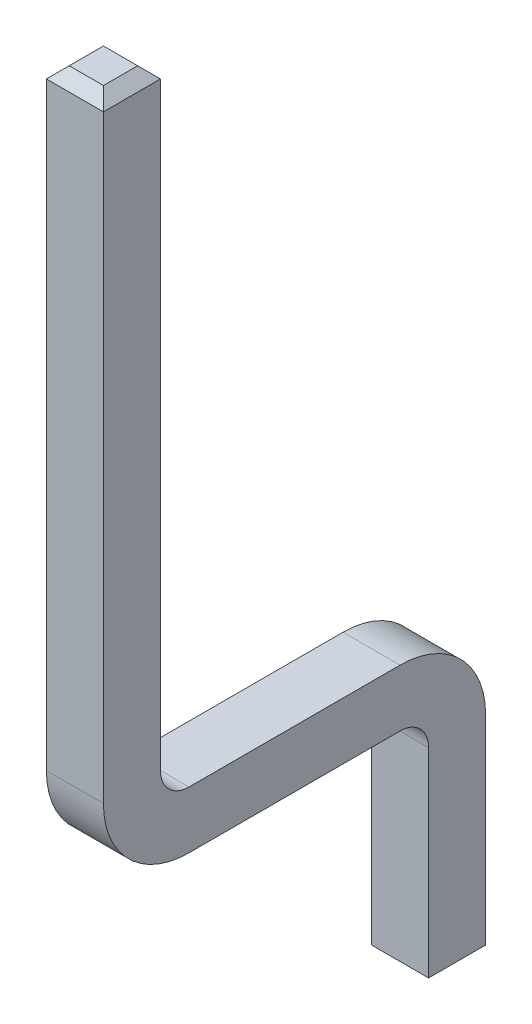
ISO-10303-21;
HEADER;
FILE_DESCRIPTION(('STEP AP214'),'2;1');
FILE_NAME('part.step','',(''),(''),'','','');
FILE_SCHEMA(('AUTOMOTIVE_DESIGN { 1 0 10303 214 1 1 1 1 }'));
ENDSEC;
DATA;
#1=APPLICATION_CONTEXT('core data for automotive mechanical design processes');
#2=APPLICATION_PROTOCOL_DEFINITION('international standard','automotive_design',2000,#1);
#3=PRODUCT_CONTEXT('',#1,'mechanical');
#4=PRODUCT('Part','Part','',(#3));
#5=PRODUCT_RELATED_PRODUCT_CATEGORY('part','',(#4));
#6=PRODUCT_DEFINITION_FORMATION('','',#4);
#7=PRODUCT_DEFINITION_CONTEXT('part definition',#1,'design');
#8=PRODUCT_DEFINITION('design','',#6,#7);
#9=PRODUCT_DEFINITION_SHAPE('','',#8);
#10=(LENGTH_UNIT() NAMED_UNIT(*) SI_UNIT(.MILLI.,.METRE.));
#11=(NAMED_UNIT(*) PLANE_ANGLE_UNIT() SI_UNIT($,.RADIAN.));
#12=(NAMED_UNIT(*) SI_UNIT($,.STERADIAN.) SOLID_ANGLE_UNIT());
#13=UNCERTAINTY_MEASURE_WITH_UNIT(LENGTH_MEASURE(1.E-05),#10,'distance_accuracy_value','');
#14=(GEOMETRIC_REPRESENTATION_CONTEXT(3) GLOBAL_UNCERTAINTY_ASSIGNED_CONTEXT((#13)) GLOBAL_UNIT_ASSIGNED_CONTEXT((#10,
#11,#12)) REPRESENTATION_CONTEXT('',''));
#15=CARTESIAN_POINT('',(0.,0.,0.));
#16=DIRECTION('',(0.,0.,1.));
#17=DIRECTION('',(1.,0.,0.));
#18=AXIS2_PLACEMENT_3D('',#15,#16,#17);
#19=CARTESIAN_POINT('',(0.800000000000005,-5.35,1.8));
#20=DIRECTION('',(-0.707106781186544,-0.707106781186551,0.));
#21=DIRECTION('',(0.707106781186551,-0.707106781186544,0.));
#22=AXIS2_PLACEMENT_3D('',#19,#20,#21);
#23=PLANE('',#22);
#24=DIRECTION('',(0.,0.,1.));
#25=VECTOR('',#24,1.);
#26=CARTESIAN_POINT('',(0.850000000000005,-5.4,0.250000000000002));
#27=LINE('',#26,#25);
#28=CARTESIAN_POINT('',(0.850000000000005,-5.4,0.100000000000003));
#29=VERTEX_POINT('',#28);
#30=CARTESIAN_POINT('',(0.850000000000005,-5.4,0.400000000000003));
#31=VERTEX_POINT('',#30);
#32=EDGE_CURVE('E117',#29,#31,#27,.T.);
#33=ORIENTED_EDGE('',*,*,#32,.T.);
#34=DIRECTION('',(0.577350269189619,-0.577350269189627,-0.577350269189631));
#35=VECTOR('',#34,1.);
#36=CARTESIAN_POINT('',(0.750000000000006,-5.3,0.500000000000004));
#37=LINE('',#36,#35);
#38=CARTESIAN_POINT('',(0.750000000000006,-5.3,0.500000000000004));
#39=VERTEX_POINT('',#38);
#40=EDGE_CURVE('E119',#39,#31,#37,.T.);
#41=ORIENTED_EDGE('',*,*,#40,.F.);
#42=DIRECTION('',(0.,0.,1.));
#43=VECTOR('',#42,1.);
#44=CARTESIAN_POINT('',(0.750000000000006,-5.3,3.35));
#45=LINE('',#44,#43);
#46=CARTESIAN_POINT('',(0.750000000000006,-5.3,0.));
#47=VERTEX_POINT('',#46);
#48=EDGE_CURVE('E236',#47,#39,#45,.T.);
#49=ORIENTED_EDGE('',*,*,#48,.F.);
#50=DIRECTION('',(-0.577350269189619,0.577350269189627,-0.577350269189631));
#51=VECTOR('',#50,1.);
#52=CARTESIAN_POINT('',(0.850000000000005,-5.4,0.100000000000004));
#53=LINE('',#52,#51);
#54=EDGE_CURVE('E122',#29,#47,#53,.T.);
#55=ORIENTED_EDGE('',*,*,#54,.F.);
#56=EDGE_LOOP('',(#33,#41,#49,#55));
#57=FACE_BOUND('',#56,.T.);
#58=ADVANCED_FACE('F14',(#57),#23,.T.);
#59=CARTESIAN_POINT('',(0.800000000000005,2.75,3.225));
#60=DIRECTION('',(-0.707106781186548,0.707106781186547,0.));
#61=DIRECTION('',(-0.707106781186547,-0.707106781186548,0.));
#62=AXIS2_PLACEMENT_3D('',#59,#60,#61);
#63=PLANE('',#62);
#64=DIRECTION('',(0.,0.,1.));
#65=VECTOR('',#64,1.);
#66=CARTESIAN_POINT('',(0.750000000000006,2.7,3.35));
#67=LINE('',#66,#65);
#68=CARTESIAN_POINT('',(0.750000000000006,2.7,3.35));
#69=VERTEX_POINT('',#68);
#70=CARTESIAN_POINT('',(0.750000000000006,2.7,2.85));
#71=VERTEX_POINT('',#70);
#72=EDGE_CURVE('E233',#69,#71,#67,.F.);
#73=ORIENTED_EDGE('',*,*,#72,.F.);
#74=DIRECTION('',(-0.577350269189622,-0.577350269189625,0.57735026918963));
#75=VECTOR('',#74,1.);
#76=CARTESIAN_POINT('',(0.850000000000005,2.8,3.25));
#77=LINE('',#76,#75);
#78=CARTESIAN_POINT('',(0.850000000000005,2.8,3.25));
#79=VERTEX_POINT('',#78);
#80=EDGE_CURVE('E239',#79,#69,#77,.T.);
#81=ORIENTED_EDGE('',*,*,#80,.F.);
#82=DIRECTION('',(0.,0.,1.));
#83=VECTOR('',#82,1.);
#84=CARTESIAN_POINT('',(0.850000000000005,2.8,3.1));
#85=LINE('',#84,#83);
#86=CARTESIAN_POINT('',(0.850000000000005,2.8,2.95));
#87=VERTEX_POINT('',#86);
#88=EDGE_CURVE('E96',#87,#79,#85,.T.);
#89=ORIENTED_EDGE('',*,*,#88,.F.);
#90=DIRECTION('',(0.577350269189622,0.577350269189627,0.577350269189629));
#91=VECTOR('',#90,1.);
#92=CARTESIAN_POINT('',(0.750000000000006,2.7,2.85));
#93=LINE('',#92,#91);
#94=EDGE_CURVE('E247',#71,#87,#93,.T.);
#95=ORIENTED_EDGE('',*,*,#94,.F.);
#96=EDGE_LOOP('',(#73,#81,#89,#95));
#97=FACE_BOUND('',#96,.T.);
#98=ADVANCED_FACE('F386',(#97),#63,.T.);
#99=CARTESIAN_POINT('',(1.125,-5.35,0.450000000000004));
#100=DIRECTION('',(0.,-0.707106781186551,0.707106781186544));
#101=DIRECTION('',(0.,-0.707106781186544,-0.707106781186551));
#102=AXIS2_PLACEMENT_3D('',#99,#100,#101);
#103=PLANE('',#102);
#104=DIRECTION('',(1.,0.,0.));
#105=VECTOR('',#104,1.);
#106=CARTESIAN_POINT('',(1.,-5.4,0.400000000000003));
#107=LINE('',#106,#105);
#108=CARTESIAN_POINT('',(1.15,-5.4,0.400000000000004));
#109=VERTEX_POINT('',#108);
#110=EDGE_CURVE('E126',#31,#109,#107,.T.);
#111=ORIENTED_EDGE('',*,*,#110,.T.);
#112=DIRECTION('',(-0.577350269189629,-0.577350269189623,-0.577350269189625));
#113=VECTOR('',#112,1.);
#114=CARTESIAN_POINT('',(1.25,-5.3,0.500000000000004));
#115=LINE('',#114,#113);
#116=CARTESIAN_POINT('',(1.25,-5.3,0.500000000000003));
#117=VERTEX_POINT('',#116);
#118=EDGE_CURVE('E217',#117,#109,#115,.T.);
#119=ORIENTED_EDGE('',*,*,#118,.F.);
#120=DIRECTION('',(1.,0.,0.));
#121=VECTOR('',#120,1.);
#122=CARTESIAN_POINT('',(1.25,-5.3,0.500000000000004));
#123=LINE('',#122,#121);
#124=EDGE_CURVE('E134',#39,#117,#123,.T.);
#125=ORIENTED_EDGE('',*,*,#124,.F.);
#126=ORIENTED_EDGE('',*,*,#40,.T.);
#127=EDGE_LOOP('',(#111,#119,#125,#126));
#128=FACE_BOUND('',#127,.T.);
#129=ADVANCED_FACE('F130',(#128),#103,.T.);
#130=CARTESIAN_POINT('',(1.,-5.4,0.250000000000002));
#131=DIRECTION('',(0.,1.,0.));
#132=DIRECTION('',(0.,0.,1.));
#133=AXIS2_PLACEMENT_3D('',#130,#131,#132);
#134=PLANE('',#133);
#135=DIRECTION('',(0.,0.,1.));
#136=VECTOR('',#135,1.);
#137=CARTESIAN_POINT('',(1.15,-5.4,1.55));
#138=LINE('',#137,#136);
#139=CARTESIAN_POINT('',(1.15,-5.4,0.100000000000003));
#140=VERTEX_POINT('',#139);
#141=EDGE_CURVE('E139',#109,#140,#138,.F.);
#142=ORIENTED_EDGE('',*,*,#141,.F.);
#143=ORIENTED_EDGE('',*,*,#110,.F.);
#144=ORIENTED_EDGE('',*,*,#32,.F.);
#145=DIRECTION('',(1.,0.,0.));
#146=VECTOR('',#145,1.);
#147=CARTESIAN_POINT('',(0.875000000000005,-5.4,0.100000000000004));
#148=LINE('',#147,#146);
#149=EDGE_CURVE('E141',#140,#29,#148,.F.);
#150=ORIENTED_EDGE('',*,*,#149,.F.);
#151=EDGE_LOOP('',(#142,#143,#144,#150));
#152=FACE_BOUND('',#151,.T.);
#153=ADVANCED_FACE('F137',(#152),#134,.F.);
#154=CARTESIAN_POINT('',(0.875000000000005,-5.35,0.0500000000000028));
#155=DIRECTION('',(0.,-0.707106781186551,-0.707106781186544));
#156=DIRECTION('',(0.,0.707106781186544,-0.707106781186551));
#157=AXIS2_PLACEMENT_3D('',#154,#155,#156);
#158=PLANE('',#157);
#159=DIRECTION('',(1.,0.,0.));
#160=VECTOR('',#159,1.);
#161=CARTESIAN_POINT('',(0.750000000000006,-5.3,0.));
#162=LINE('',#161,#160);
#163=CARTESIAN_POINT('',(1.25,-5.3,0.));
#164=VERTEX_POINT('',#163);
#165=EDGE_CURVE('E199',#164,#47,#162,.F.);
#166=ORIENTED_EDGE('',*,*,#165,.F.);
#167=DIRECTION('',(0.577350269189628,0.577350269189622,-0.577350269189627));
#168=VECTOR('',#167,1.);
#169=CARTESIAN_POINT('',(1.15,-5.4,0.100000000000003));
#170=LINE('',#169,#168);
#171=EDGE_CURVE('E205',#140,#164,#170,.T.);
#172=ORIENTED_EDGE('',*,*,#171,.F.);
#173=ORIENTED_EDGE('',*,*,#149,.T.);
#174=ORIENTED_EDGE('',*,*,#54,.T.);
#175=EDGE_LOOP('',(#166,#172,#173,#174));
#176=FACE_BOUND('',#175,.T.);
#177=ADVANCED_FACE('F298',(#176),#158,.T.);
#178=CARTESIAN_POINT('',(1.,2.8,3.1));
#179=DIRECTION('',(0.,1.,0.));
#180=DIRECTION('',(0.,0.,1.));
#181=AXIS2_PLACEMENT_3D('',#178,#179,#180);
#182=PLANE('',#181);
#183=DIRECTION('',(0.,0.,1.));
#184=VECTOR('',#183,1.);
#185=CARTESIAN_POINT('',(1.15,2.8,2.975));
#186=LINE('',#185,#184);
#187=CARTESIAN_POINT('',(1.15,2.8,2.95));
#188=VERTEX_POINT('',#187);
#189=CARTESIAN_POINT('',(1.15,2.8,3.25));
#190=VERTEX_POINT('',#189);
#191=EDGE_CURVE('E250',#188,#190,#186,.T.);
#192=ORIENTED_EDGE('',*,*,#191,.F.);
#193=DIRECTION('',(1.,0.,0.));
#194=VECTOR('',#193,1.);
#195=CARTESIAN_POINT('',(0.875000000000005,2.8,2.95));
#196=LINE('',#195,#194);
#197=EDGE_CURVE('E158',#87,#188,#196,.T.);
#198=ORIENTED_EDGE('',*,*,#197,.F.);
#199=ORIENTED_EDGE('',*,*,#88,.T.);
#200=DIRECTION('',(1.,0.,0.));
#201=VECTOR('',#200,1.);
#202=CARTESIAN_POINT('',(1.125,2.8,3.25));
#203=LINE('',#202,#201);
#204=EDGE_CURVE('E242',#190,#79,#203,.F.);
#205=ORIENTED_EDGE('',*,*,#204,.F.);
#206=EDGE_LOOP('',(#192,#198,#199,#205));
#207=FACE_BOUND('',#206,.T.);
#208=ADVANCED_FACE('F375',(#207),#182,.T.);
#209=CARTESIAN_POINT('',(0.875000000000005,2.75,2.9));
#210=DIRECTION('',(0.,0.707106781186548,-0.707106781186547));
#211=DIRECTION('',(0.,0.707106781186547,0.707106781186548));
#212=AXIS2_PLACEMENT_3D('',#209,#210,#211);
#213=PLANE('',#212);
#214=DIRECTION('',(-1.,0.,0.));
#215=VECTOR('',#214,1.);
#216=CARTESIAN_POINT('',(0.750000000000006,2.7,2.85));
#217=LINE('',#216,#215);
#218=CARTESIAN_POINT('',(1.25,2.7,2.85));
#219=VERTEX_POINT('',#218);
#220=EDGE_CURVE('E254',#71,#219,#217,.F.);
#221=ORIENTED_EDGE('',*,*,#220,.F.);
#222=ORIENTED_EDGE('',*,*,#94,.T.);
#223=ORIENTED_EDGE('',*,*,#197,.T.);
#224=DIRECTION('',(-0.577350269189626,0.577350269189625,0.577350269189627));
#225=VECTOR('',#224,1.);
#226=CARTESIAN_POINT('',(1.25,2.7,2.85));
#227=LINE('',#226,#225);
#228=EDGE_CURVE('E319',#219,#188,#227,.T.);
#229=ORIENTED_EDGE('',*,*,#228,.F.);
#230=EDGE_LOOP('',(#221,#222,#223,#229));
#231=FACE_BOUND('',#230,.T.);
#232=ADVANCED_FACE('F379',(#231),#213,.T.);
#233=CARTESIAN_POINT('',(1.125,2.75,3.3));
#234=DIRECTION('',(0.,0.707106781186548,0.707106781186547));
#235=DIRECTION('',(0.,-0.707106781186547,0.707106781186548));
#236=AXIS2_PLACEMENT_3D('',#233,#234,#235);
#237=PLANE('',#236);
#238=ORIENTED_EDGE('',*,*,#204,.T.);
#239=ORIENTED_EDGE('',*,*,#80,.T.);
#240=DIRECTION('',(1.,0.,0.));
#241=VECTOR('',#240,1.);
#242=CARTESIAN_POINT('',(1.25,2.7,3.35));
#243=LINE('',#242,#241);
#244=CARTESIAN_POINT('',(1.25,2.7,3.35));
#245=VERTEX_POINT('',#244);
#246=EDGE_CURVE('E230',#245,#69,#243,.F.);
#247=ORIENTED_EDGE('',*,*,#246,.F.);
#248=DIRECTION('',(0.577350269189627,-0.577350269189625,0.577350269189625));
#249=VECTOR('',#248,1.);
#250=CARTESIAN_POINT('',(1.15,2.8,3.25));
#251=LINE('',#250,#249);
#252=EDGE_CURVE('E253',#190,#245,#251,.T.);
#253=ORIENTED_EDGE('',*,*,#252,.F.);
#254=EDGE_LOOP('',(#238,#239,#247,#253));
#255=FACE_BOUND('',#254,.T.);
#256=ADVANCED_FACE('F387',(#255),#237,.T.);
#257=CARTESIAN_POINT('',(0.750000000000006,3.2,3.35));
#258=DIRECTION('',(-1.,0.,0.));
#259=DIRECTION('',(0.,0.,1.));
#260=AXIS2_PLACEMENT_3D('',#257,#258,#259);
#261=PLANE('',#260);
#262=CARTESIAN_POINT('',(0.750000000000006,-2.55,2.6));
#263=DIRECTION('',(1.,0.,0.));
#264=DIRECTION('',(0.,0.,-1.));
#265=AXIS2_PLACEMENT_3D('',#262,#263,#264);
#266=CIRCLE('',#265,0.25);
#267=CARTESIAN_POINT('',(0.750000000000006,-2.55,2.85));
#268=VERTEX_POINT('',#267);
#269=CARTESIAN_POINT('',(0.750000000000006,-2.8,2.6));
#270=VERTEX_POINT('',#269);
#271=EDGE_CURVE('E184',#268,#270,#266,.T.);
#272=ORIENTED_EDGE('',*,*,#271,.T.);
#273=DIRECTION('',(0.,0.,1.));
#274=VECTOR('',#273,1.);
#275=CARTESIAN_POINT('',(0.750000000000006,-2.8,2.6));
#276=LINE('',#275,#274);
#277=CARTESIAN_POINT('',(0.750000000000006,-2.8,0.750000000000004));
#278=VERTEX_POINT('',#277);
#279=EDGE_CURVE('E186',#278,#270,#276,.T.);
#280=ORIENTED_EDGE('',*,*,#279,.F.);
#281=CARTESIAN_POINT('',(0.750000000000006,-3.55,0.750000000000004));
#282=DIRECTION('',(-1.,0.,0.));
#283=DIRECTION('',(0.,0.,1.));
#284=AXIS2_PLACEMENT_3D('',#281,#282,#283);
#285=CIRCLE('',#284,0.750000000000001);
#286=CARTESIAN_POINT('',(0.750000000000006,-3.55,0.));
#287=VERTEX_POINT('',#286);
#288=EDGE_CURVE('E187',#287,#278,#285,.F.);
#289=ORIENTED_EDGE('',*,*,#288,.F.);
#290=DIRECTION('',(0.,1.,0.));
#291=VECTOR('',#290,1.);
#292=CARTESIAN_POINT('',(0.750000000000006,-3.55,0.));
#293=LINE('',#292,#291);
#294=EDGE_CURVE('E196',#47,#287,#293,.T.);
#295=ORIENTED_EDGE('',*,*,#294,.F.);
#296=ORIENTED_EDGE('',*,*,#48,.T.);
#297=DIRECTION('',(0.,1.,0.));
#298=VECTOR('',#297,1.);
#299=CARTESIAN_POINT('',(0.750000000000006,-3.55,0.500000000000003));
#300=LINE('',#299,#298);
#301=CARTESIAN_POINT('',(0.750000000000006,-3.55,0.500000000000003));
#302=VERTEX_POINT('',#301);
#303=EDGE_CURVE('E152',#302,#39,#300,.F.);
#304=ORIENTED_EDGE('',*,*,#303,.F.);
#305=CARTESIAN_POINT('',(0.750000000000006,-3.55,0.750000000000004));
#306=DIRECTION('',(-1.,0.,0.));
#307=DIRECTION('',(0.,0.,1.));
#308=AXIS2_PLACEMENT_3D('',#305,#306,#307);
#309=CIRCLE('',#308,0.25);
#310=CARTESIAN_POINT('',(0.750000000000006,-3.3,0.750000000000004));
#311=VERTEX_POINT('',#310);
#312=EDGE_CURVE('E17',#302,#311,#309,.F.);
#313=ORIENTED_EDGE('',*,*,#312,.T.);
#314=DIRECTION('',(0.,0.,1.));
#315=VECTOR('',#314,1.);
#316=CARTESIAN_POINT('',(0.750000000000006,-3.3,2.6));
#317=LINE('',#316,#315);
#318=CARTESIAN_POINT('',(0.750000000000006,-3.3,2.6));
#319=VERTEX_POINT('',#318);
#320=EDGE_CURVE('E179',#319,#311,#317,.F.);
#321=ORIENTED_EDGE('',*,*,#320,.F.);
#322=CARTESIAN_POINT('',(0.750000000000006,-2.55,2.6));
#323=DIRECTION('',(1.,0.,0.));
#324=DIRECTION('',(0.,0.,-1.));
#325=AXIS2_PLACEMENT_3D('',#322,#323,#324);
#326=CIRCLE('',#325,0.750000000000001);
#327=CARTESIAN_POINT('',(0.750000000000006,-2.55,3.35));
#328=VERTEX_POINT('',#327);
#329=EDGE_CURVE('E180',#328,#319,#326,.T.);
#330=ORIENTED_EDGE('',*,*,#329,.F.);
#331=DIRECTION('',(0.,1.,0.));
#332=VECTOR('',#331,1.);
#333=CARTESIAN_POINT('',(0.750000000000006,3.2,3.35));
#334=LINE('',#333,#332);
#335=EDGE_CURVE('E228',#69,#328,#334,.F.);
#336=ORIENTED_EDGE('',*,*,#335,.F.);
#337=ORIENTED_EDGE('',*,*,#72,.T.);
#338=DIRECTION('',(0.,1.,0.));
#339=VECTOR('',#338,1.);
#340=CARTESIAN_POINT('',(0.750000000000006,3.2,2.85));
#341=LINE('',#340,#339);
#342=EDGE_CURVE('E265',#268,#71,#341,.T.);
#343=ORIENTED_EDGE('',*,*,#342,.F.);
#344=EDGE_LOOP('',(#272,#280,#289,#295,#296,#304,#313,#321,#330,#336,#337,#343));
#345=FACE_BOUND('',#344,.T.);
#346=ADVANCED_FACE('F293',(#345),#261,.T.);
#347=CARTESIAN_POINT('',(1.,-3.55,0.750000000000004));
#348=DIRECTION('',(-1.,0.,0.));
#349=DIRECTION('',(0.,0.,1.));
#350=AXIS2_PLACEMENT_3D('',#347,#348,#349);
#351=CYLINDRICAL_SURFACE('',#350,0.25);
#352=DIRECTION('',(1.,0.,0.));
#353=VECTOR('',#352,1.);
#354=CARTESIAN_POINT('',(1.25,-3.55,0.500000000000004));
#355=LINE('',#354,#353);
#356=CARTESIAN_POINT('',(1.25,-3.55,0.500000000000003));
#357=VERTEX_POINT('',#356);
#358=EDGE_CURVE('E154',#357,#302,#355,.F.);
#359=ORIENTED_EDGE('',*,*,#358,.F.);
#360=CARTESIAN_POINT('',(1.25,-3.55,0.750000000000004));
#361=DIRECTION('',(-1.,0.,0.));
#362=DIRECTION('',(0.,0.,1.));
#363=AXIS2_PLACEMENT_3D('',#360,#361,#362);
#364=CIRCLE('',#363,0.25);
#365=CARTESIAN_POINT('',(1.25,-3.3,0.750000000000004));
#366=VERTEX_POINT('',#365);
#367=EDGE_CURVE('E175',#366,#357,#364,.T.);
#368=ORIENTED_EDGE('',*,*,#367,.F.);
#369=DIRECTION('',(1.,0.,0.));
#370=VECTOR('',#369,1.);
#371=CARTESIAN_POINT('',(1.25,-3.3,0.750000000000004));
#372=LINE('',#371,#370);
#373=EDGE_CURVE('E182',#311,#366,#372,.T.);
#374=ORIENTED_EDGE('',*,*,#373,.F.);
#375=ORIENTED_EDGE('',*,*,#312,.F.);
#376=EDGE_LOOP('',(#359,#368,#374,#375));
#377=FACE_BOUND('',#376,.T.);
#378=ADVANCED_FACE('F395',(#377),#351,.F.);
#379=CARTESIAN_POINT('',(1.25,-3.55,0.500000000000004));
#380=DIRECTION('',(0.,0.,1.));
#381=DIRECTION('',(1.,0.,0.));
#382=AXIS2_PLACEMENT_3D('',#379,#380,#381);
#383=PLANE('',#382);
#384=ORIENTED_EDGE('',*,*,#124,.T.);
#385=DIRECTION('',(0.,1.,0.));
#386=VECTOR('',#385,1.);
#387=CARTESIAN_POINT('',(1.25,3.2,0.500000000000003));
#388=LINE('',#387,#386);
#389=EDGE_CURVE('E178',#357,#117,#388,.F.);
#390=ORIENTED_EDGE('',*,*,#389,.F.);
#391=ORIENTED_EDGE('',*,*,#358,.T.);
#392=ORIENTED_EDGE('',*,*,#303,.T.);
#393=EDGE_LOOP('',(#384,#390,#391,#392));
#394=FACE_BOUND('',#393,.T.);
#395=ADVANCED_FACE('F291',(#394),#383,.T.);
#396=CARTESIAN_POINT('',(1.2,-5.35,1.55));
#397=DIRECTION('',(0.707106781186544,-0.707106781186551,0.));
#398=DIRECTION('',(0.707106781186551,0.707106781186544,0.));
#399=AXIS2_PLACEMENT_3D('',#396,#397,#398);
#400=PLANE('',#399);
#401=ORIENTED_EDGE('',*,*,#141,.T.);
#402=ORIENTED_EDGE('',*,*,#171,.T.);
#403=DIRECTION('',(0.,0.,-1.));
#404=VECTOR('',#403,1.);
#405=CARTESIAN_POINT('',(1.25,-5.3,2.85));
#406=LINE('',#405,#404);
#407=EDGE_CURVE('E208',#117,#164,#406,.T.);
#408=ORIENTED_EDGE('',*,*,#407,.F.);
#409=ORIENTED_EDGE('',*,*,#118,.T.);
#410=EDGE_LOOP('',(#401,#402,#408,#409));
#411=FACE_BOUND('',#410,.T.);
#412=ADVANCED_FACE('F283',(#411),#400,.T.);
#413=CARTESIAN_POINT('',(0.750000000000006,-3.55,0.));
#414=DIRECTION('',(0.,0.,-1.));
#415=DIRECTION('',(0.,1.,0.));
#416=AXIS2_PLACEMENT_3D('',#413,#414,#415);
#417=PLANE('',#416);
#418=ORIENTED_EDGE('',*,*,#165,.T.);
#419=ORIENTED_EDGE('',*,*,#294,.T.);
#420=DIRECTION('',(-1.,0.,0.));
#421=VECTOR('',#420,1.);
#422=CARTESIAN_POINT('',(1.,-3.55,0.));
#423=LINE('',#422,#421);
#424=CARTESIAN_POINT('',(1.25,-3.55,0.));
#425=VERTEX_POINT('',#424);
#426=EDGE_CURVE('E189',#425,#287,#423,.T.);
#427=ORIENTED_EDGE('',*,*,#426,.F.);
#428=DIRECTION('',(0.,1.,0.));
#429=VECTOR('',#428,1.);
#430=CARTESIAN_POINT('',(1.25,3.2,0.));
#431=LINE('',#430,#429);
#432=EDGE_CURVE('E174',#164,#425,#431,.T.);
#433=ORIENTED_EDGE('',*,*,#432,.F.);
#434=EDGE_LOOP('',(#418,#419,#427,#433));
#435=FACE_BOUND('',#434,.T.);
#436=ADVANCED_FACE('F301',(#435),#417,.T.);
#437=CARTESIAN_POINT('',(1.,-3.55,0.750000000000004));
#438=DIRECTION('',(-1.,0.,0.));
#439=DIRECTION('',(0.,0.,1.));
#440=AXIS2_PLACEMENT_3D('',#437,#438,#439);
#441=CYLINDRICAL_SURFACE('',#440,0.750000000000001);
#442=DIRECTION('',(1.,0.,0.));
#443=VECTOR('',#442,1.);
#444=CARTESIAN_POINT('',(0.750000000000006,-2.8,0.750000000000004));
#445=LINE('',#444,#443);
#446=CARTESIAN_POINT('',(1.25,-2.8,0.750000000000004));
#447=VERTEX_POINT('',#446);
#448=EDGE_CURVE('E188',#447,#278,#445,.F.);
#449=ORIENTED_EDGE('',*,*,#448,.F.);
#450=CARTESIAN_POINT('',(1.25,-3.55,0.750000000000004));
#451=DIRECTION('',(-1.,0.,0.));
#452=DIRECTION('',(0.,0.,1.));
#453=AXIS2_PLACEMENT_3D('',#450,#451,#452);
#454=CIRCLE('',#453,0.750000000000001);
#455=EDGE_CURVE('E171',#425,#447,#454,.F.);
#456=ORIENTED_EDGE('',*,*,#455,.F.);
#457=ORIENTED_EDGE('',*,*,#426,.T.);
#458=ORIENTED_EDGE('',*,*,#288,.T.);
#459=EDGE_LOOP('',(#449,#456,#457,#458));
#460=FACE_BOUND('',#459,.T.);
#461=ADVANCED_FACE('F420',(#460),#441,.T.);
#462=CARTESIAN_POINT('',(0.750000000000006,-2.8,2.6));
#463=DIRECTION('',(0.,1.,0.));
#464=DIRECTION('',(0.,0.,1.));
#465=AXIS2_PLACEMENT_3D('',#462,#463,#464);
#466=PLANE('',#465);
#467=DIRECTION('',(1.,0.,0.));
#468=VECTOR('',#467,1.);
#469=CARTESIAN_POINT('',(1.,-2.8,2.6));
#470=LINE('',#469,#468);
#471=CARTESIAN_POINT('',(1.25,-2.8,2.6));
#472=VERTEX_POINT('',#471);
#473=EDGE_CURVE('E185',#270,#472,#470,.T.);
#474=ORIENTED_EDGE('',*,*,#473,.T.);
#475=DIRECTION('',(0.,0.,-1.));
#476=VECTOR('',#475,1.);
#477=CARTESIAN_POINT('',(1.25,-2.8,2.85));
#478=LINE('',#477,#476);
#479=EDGE_CURVE('E170',#447,#472,#478,.F.);
#480=ORIENTED_EDGE('',*,*,#479,.F.);
#481=ORIENTED_EDGE('',*,*,#448,.T.);
#482=ORIENTED_EDGE('',*,*,#279,.T.);
#483=EDGE_LOOP('',(#474,#480,#481,#482));
#484=FACE_BOUND('',#483,.T.);
#485=ADVANCED_FACE('F344',(#484),#466,.T.);
#486=CARTESIAN_POINT('',(1.,-2.55,2.6));
#487=DIRECTION('',(1.,0.,0.));
#488=DIRECTION('',(0.,0.,-1.));
#489=AXIS2_PLACEMENT_3D('',#486,#487,#488);
#490=CYLINDRICAL_SURFACE('',#489,0.25);
#491=ORIENTED_EDGE('',*,*,#473,.F.);
#492=ORIENTED_EDGE('',*,*,#271,.F.);
#493=DIRECTION('',(-1.,0.,0.));
#494=VECTOR('',#493,1.);
#495=CARTESIAN_POINT('',(0.750000000000006,-2.55,2.85));
#496=LINE('',#495,#494);
#497=CARTESIAN_POINT('',(1.25,-2.55,2.85));
#498=VERTEX_POINT('',#497);
#499=EDGE_CURVE('E268',#498,#268,#496,.T.);
#500=ORIENTED_EDGE('',*,*,#499,.F.);
#501=CARTESIAN_POINT('',(1.25,-2.55,2.6));
#502=DIRECTION('',(1.,0.,0.));
#503=DIRECTION('',(0.,0.,-1.));
#504=AXIS2_PLACEMENT_3D('',#501,#502,#503);
#505=CIRCLE('',#504,0.25);
#506=EDGE_CURVE('E166',#472,#498,#505,.F.);
#507=ORIENTED_EDGE('',*,*,#506,.F.);
#508=EDGE_LOOP('',(#491,#492,#500,#507));
#509=FACE_BOUND('',#508,.T.);
#510=ADVANCED_FACE('F347',(#509),#490,.F.);
#511=CARTESIAN_POINT('',(0.750000000000006,3.2,2.85));
#512=DIRECTION('',(0.,0.,-1.));
#513=DIRECTION('',(-1.,0.,0.));
#514=AXIS2_PLACEMENT_3D('',#511,#512,#513);
#515=PLANE('',#514);
#516=ORIENTED_EDGE('',*,*,#220,.T.);
#517=DIRECTION('',(0.,1.,0.));
#518=VECTOR('',#517,1.);
#519=CARTESIAN_POINT('',(1.25,3.2,2.85));
#520=LINE('',#519,#518);
#521=EDGE_CURVE('E169',#498,#219,#520,.T.);
#522=ORIENTED_EDGE('',*,*,#521,.F.);
#523=ORIENTED_EDGE('',*,*,#499,.T.);
#524=ORIENTED_EDGE('',*,*,#342,.T.);
#525=EDGE_LOOP('',(#516,#522,#523,#524));
#526=FACE_BOUND('',#525,.T.);
#527=ADVANCED_FACE('F382',(#526),#515,.T.);
#528=CARTESIAN_POINT('',(1.2,2.75,2.975));
#529=DIRECTION('',(0.707106781186547,0.707106781186548,0.));
#530=DIRECTION('',(-0.707106781186548,0.707106781186547,0.));
#531=AXIS2_PLACEMENT_3D('',#528,#529,#530);
#532=PLANE('',#531);
#533=DIRECTION('',(0.,0.,-1.));
#534=VECTOR('',#533,1.);
#535=CARTESIAN_POINT('',(1.25,2.7,2.85));
#536=LINE('',#535,#534);
#537=EDGE_CURVE('E322',#219,#245,#536,.F.);
#538=ORIENTED_EDGE('',*,*,#537,.F.);
#539=ORIENTED_EDGE('',*,*,#228,.T.);
#540=ORIENTED_EDGE('',*,*,#191,.T.);
#541=ORIENTED_EDGE('',*,*,#252,.T.);
#542=EDGE_LOOP('',(#538,#539,#540,#541));
#543=FACE_BOUND('',#542,.T.);
#544=ADVANCED_FACE('F380',(#543),#532,.T.);
#545=CARTESIAN_POINT('',(1.25,3.2,3.35));
#546=DIRECTION('',(0.,0.,1.));
#547=DIRECTION('',(1.,0.,0.));
#548=AXIS2_PLACEMENT_3D('',#545,#546,#547);
#549=PLANE('',#548);
#550=ORIENTED_EDGE('',*,*,#246,.T.);
#551=ORIENTED_EDGE('',*,*,#335,.T.);
#552=DIRECTION('',(1.,0.,0.));
#553=VECTOR('',#552,1.);
#554=CARTESIAN_POINT('',(1.,-2.55,3.35));
#555=LINE('',#554,#553);
#556=CARTESIAN_POINT('',(1.25,-2.55,3.35));
#557=VERTEX_POINT('',#556);
#558=EDGE_CURVE('E183',#557,#328,#555,.F.);
#559=ORIENTED_EDGE('',*,*,#558,.F.);
#560=DIRECTION('',(0.,1.,0.));
#561=VECTOR('',#560,1.);
#562=CARTESIAN_POINT('',(1.25,3.2,3.35));
#563=LINE('',#562,#561);
#564=EDGE_CURVE('E165',#245,#557,#563,.F.);
#565=ORIENTED_EDGE('',*,*,#564,.F.);
#566=EDGE_LOOP('',(#550,#551,#559,#565));
#567=FACE_BOUND('',#566,.T.);
#568=ADVANCED_FACE('F361',(#567),#549,.T.);
#569=CARTESIAN_POINT('',(1.,-2.55,2.6));
#570=DIRECTION('',(1.,0.,0.));
#571=DIRECTION('',(0.,0.,-1.));
#572=AXIS2_PLACEMENT_3D('',#569,#570,#571);
#573=CYLINDRICAL_SURFACE('',#572,0.750000000000001);
#574=ORIENTED_EDGE('',*,*,#558,.T.);
#575=ORIENTED_EDGE('',*,*,#329,.T.);
#576=DIRECTION('',(1.,0.,0.));
#577=VECTOR('',#576,1.);
#578=CARTESIAN_POINT('',(1.25,-3.3,2.6));
#579=LINE('',#578,#577);
#580=CARTESIAN_POINT('',(1.25,-3.3,2.6));
#581=VERTEX_POINT('',#580);
#582=EDGE_CURVE('E32',#581,#319,#579,.F.);
#583=ORIENTED_EDGE('',*,*,#582,.F.);
#584=CARTESIAN_POINT('',(1.25,-2.55,2.6));
#585=DIRECTION('',(1.,0.,0.));
#586=DIRECTION('',(0.,0.,-1.));
#587=AXIS2_PLACEMENT_3D('',#584,#585,#586);
#588=CIRCLE('',#587,0.750000000000001);
#589=EDGE_CURVE('E23',#557,#581,#588,.T.);
#590=ORIENTED_EDGE('',*,*,#589,.F.);
#591=EDGE_LOOP('',(#574,#575,#583,#590));
#592=FACE_BOUND('',#591,.T.);
#593=ADVANCED_FACE('F404',(#592),#573,.T.);
#594=CARTESIAN_POINT('',(1.25,-3.3,2.6));
#595=DIRECTION('',(0.,-1.,0.));
#596=DIRECTION('',(1.,0.,0.));
#597=AXIS2_PLACEMENT_3D('',#594,#595,#596);
#598=PLANE('',#597);
#599=ORIENTED_EDGE('',*,*,#582,.T.);
#600=ORIENTED_EDGE('',*,*,#320,.T.);
#601=ORIENTED_EDGE('',*,*,#373,.T.);
#602=DIRECTION('',(0.,0.,-1.));
#603=VECTOR('',#602,1.);
#604=CARTESIAN_POINT('',(1.25,-3.3,2.85));
#605=LINE('',#604,#603);
#606=EDGE_CURVE('E9',#581,#366,#605,.T.);
#607=ORIENTED_EDGE('',*,*,#606,.F.);
#608=EDGE_LOOP('',(#599,#600,#601,#607));
#609=FACE_BOUND('',#608,.T.);
#610=ADVANCED_FACE('F399',(#609),#598,.T.);
#611=CARTESIAN_POINT('',(1.25,3.2,2.85));
#612=DIRECTION('',(1.,0.,0.));
#613=DIRECTION('',(0.,0.,-1.));
#614=AXIS2_PLACEMENT_3D('',#611,#612,#613);
#615=PLANE('',#614);
#616=ORIENTED_EDGE('',*,*,#589,.T.);
#617=ORIENTED_EDGE('',*,*,#606,.T.);
#618=ORIENTED_EDGE('',*,*,#367,.T.);
#619=ORIENTED_EDGE('',*,*,#389,.T.);
#620=ORIENTED_EDGE('',*,*,#407,.T.);
#621=ORIENTED_EDGE('',*,*,#432,.T.);
#622=ORIENTED_EDGE('',*,*,#455,.T.);
#623=ORIENTED_EDGE('',*,*,#479,.T.);
#624=ORIENTED_EDGE('',*,*,#506,.T.);
#625=ORIENTED_EDGE('',*,*,#521,.T.);
#626=ORIENTED_EDGE('',*,*,#537,.T.);
#627=ORIENTED_EDGE('',*,*,#564,.T.);
#628=EDGE_LOOP('',(#616,#617,#618,#619,#620,#621,#622,#623,#624,#625,#626,#627));
#629=FACE_BOUND('',#628,.T.);
#630=ADVANCED_FACE('F305',(#629),#615,.T.);
#631=CLOSED_SHELL('',(#58,#98,#129,#153,#177,#208,#232,#256,#346,#378,#395,#412,#436,#461,#485,
#510,#527,#544,#568,#593,#610,#630));
#632=MANIFOLD_SOLID_BREP('B1',#631);
#633=ADVANCED_BREP_SHAPE_REPRESENTATION('',(#18,#632),#14);
#634=SHAPE_DEFINITION_REPRESENTATION(#9,#633);
ENDSEC;
END-ISO-10303-21;
